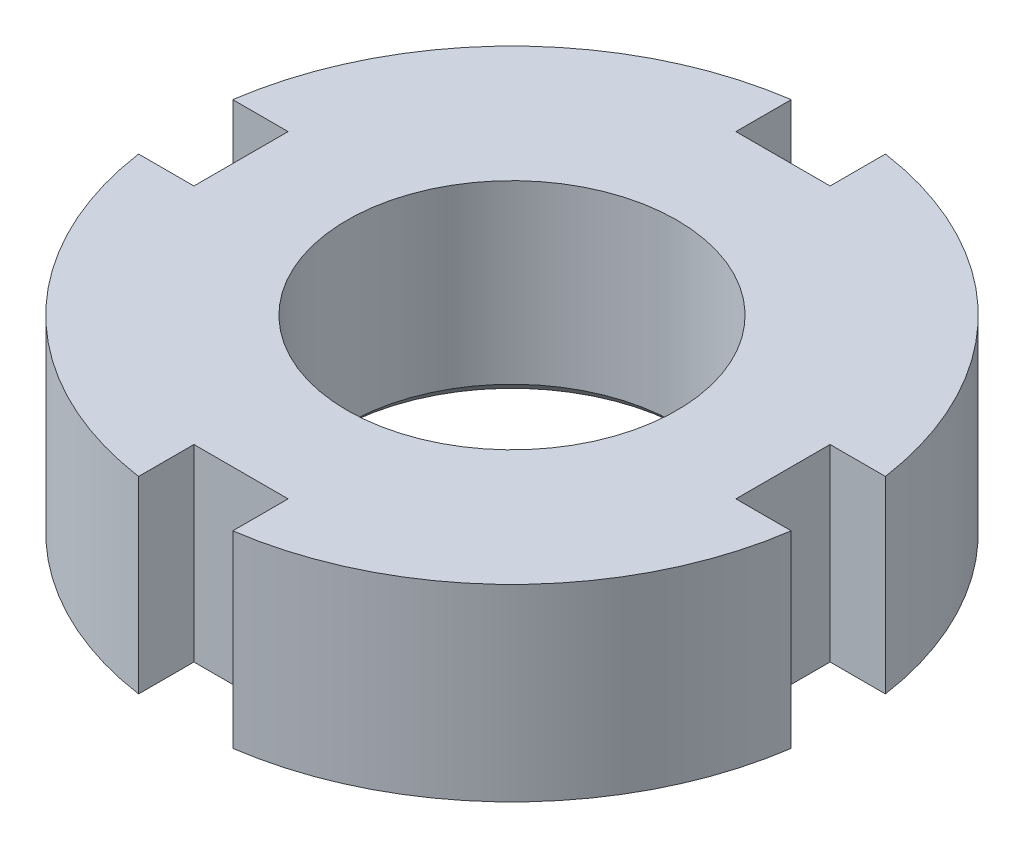
ISO-10303-21;
HEADER;
FILE_DESCRIPTION(('STEP AP214'),'2;1');
FILE_NAME('part.step','',(''),(''),'','','');
FILE_SCHEMA(('AUTOMOTIVE_DESIGN { 1 0 10303 214 1 1 1 1 }'));
ENDSEC;
DATA;
#1=APPLICATION_CONTEXT('core data for automotive mechanical design processes');
#2=APPLICATION_PROTOCOL_DEFINITION('international standard','automotive_design',2000,#1);
#3=PRODUCT_CONTEXT('',#1,'mechanical');
#4=PRODUCT('Part','Part','',(#3));
#5=PRODUCT_RELATED_PRODUCT_CATEGORY('part','',(#4));
#6=PRODUCT_DEFINITION_FORMATION('','',#4);
#7=PRODUCT_DEFINITION_CONTEXT('part definition',#1,'design');
#8=PRODUCT_DEFINITION('design','',#6,#7);
#9=PRODUCT_DEFINITION_SHAPE('','',#8);
#10=(LENGTH_UNIT() NAMED_UNIT(*) SI_UNIT(.MILLI.,.METRE.));
#11=(NAMED_UNIT(*) PLANE_ANGLE_UNIT() SI_UNIT($,.RADIAN.));
#12=(NAMED_UNIT(*) SI_UNIT($,.STERADIAN.) SOLID_ANGLE_UNIT());
#13=UNCERTAINTY_MEASURE_WITH_UNIT(LENGTH_MEASURE(1.E-05),#10,'distance_accuracy_value','');
#14=(GEOMETRIC_REPRESENTATION_CONTEXT(3) GLOBAL_UNCERTAINTY_ASSIGNED_CONTEXT((#13)) GLOBAL_UNIT_ASSIGNED_CONTEXT((#10,
#11,#12)) REPRESENTATION_CONTEXT('',''));
#15=CARTESIAN_POINT('',(0.,0.,0.));
#16=DIRECTION('',(0.,0.,1.));
#17=DIRECTION('',(1.,0.,0.));
#18=AXIS2_PLACEMENT_3D('',#15,#16,#17);
#19=CARTESIAN_POINT('',(23.012812921102,8.,-4.));
#20=DIRECTION('',(-1.,0.,0.));
#21=DIRECTION('',(0.,0.,1.));
#22=AXIS2_PLACEMENT_3D('',#19,#20,#21);
#23=PLANE('',#22);
#24=DIRECTION('',(0.,0.,-1.));
#25=VECTOR('',#24,1.);
#26=CARTESIAN_POINT('',(23.012812921102,-8.,-4.));
#27=LINE('',#26,#25);
#28=CARTESIAN_POINT('',(23.012812921102,-8.,4.));
#29=VERTEX_POINT('',#28);
#30=CARTESIAN_POINT('',(23.012812921102,-8.,-4.));
#31=VERTEX_POINT('',#30);
#32=EDGE_CURVE('E200',#29,#31,#27,.T.);
#33=ORIENTED_EDGE('',*,*,#32,.T.);
#34=DIRECTION('',(0.,-1.,0.));
#35=VECTOR('',#34,1.);
#36=CARTESIAN_POINT('',(23.012812921102,8.,-4.));
#37=LINE('',#36,#35);
#38=CARTESIAN_POINT('',(23.012812921102,8.,-4.));
#39=VERTEX_POINT('',#38);
#40=EDGE_CURVE('E11',#39,#31,#37,.T.);
#41=ORIENTED_EDGE('',*,*,#40,.F.);
#42=DIRECTION('',(0.,0.,-1.));
#43=VECTOR('',#42,1.);
#44=CARTESIAN_POINT('',(23.012812921102,8.,-4.));
#45=LINE('',#44,#43);
#46=CARTESIAN_POINT('',(23.012812921102,8.,4.));
#47=VERTEX_POINT('',#46);
#48=EDGE_CURVE('E247',#47,#39,#45,.T.);
#49=ORIENTED_EDGE('',*,*,#48,.F.);
#50=DIRECTION('',(0.,-1.,0.));
#51=VECTOR('',#50,1.);
#52=CARTESIAN_POINT('',(23.012812921102,8.,4.));
#53=LINE('',#52,#51);
#54=EDGE_CURVE('E196',#47,#29,#53,.T.);
#55=ORIENTED_EDGE('',*,*,#54,.T.);
#56=EDGE_LOOP('',(#33,#41,#49,#55));
#57=FACE_BOUND('',#56,.T.);
#58=ADVANCED_FACE('F51',(#57),#23,.F.);
#59=CARTESIAN_POINT('',(23.012812921102,8.,-4.));
#60=DIRECTION('',(0.,0.,-1.));
#61=DIRECTION('',(-1.,0.,0.));
#62=AXIS2_PLACEMENT_3D('',#59,#60,#61);
#63=PLANE('',#62);
#64=DIRECTION('',(1.,0.,0.));
#65=VECTOR('',#64,1.);
#66=CARTESIAN_POINT('',(23.012812921102,-8.,-4.));
#67=LINE('',#66,#65);
#68=CARTESIAN_POINT('',(27.712812921102,-8.,-4.));
#69=VERTEX_POINT('',#68);
#70=EDGE_CURVE('E204',#31,#69,#67,.T.);
#71=ORIENTED_EDGE('',*,*,#70,.T.);
#72=DIRECTION('',(0.,-1.,0.));
#73=VECTOR('',#72,1.);
#74=CARTESIAN_POINT('',(27.712812921102,8.,-4.));
#75=LINE('',#74,#73);
#76=CARTESIAN_POINT('',(27.712812921102,8.,-4.));
#77=VERTEX_POINT('',#76);
#78=EDGE_CURVE('E60',#77,#69,#75,.T.);
#79=ORIENTED_EDGE('',*,*,#78,.F.);
#80=DIRECTION('',(1.,0.,0.));
#81=VECTOR('',#80,1.);
#82=CARTESIAN_POINT('',(23.012812921102,8.,-4.));
#83=LINE('',#82,#81);
#84=EDGE_CURVE('E135',#39,#77,#83,.T.);
#85=ORIENTED_EDGE('',*,*,#84,.F.);
#86=ORIENTED_EDGE('',*,*,#40,.T.);
#87=EDGE_LOOP('',(#71,#79,#85,#86));
#88=FACE_BOUND('',#87,.T.);
#89=ADVANCED_FACE('F370',(#88),#63,.F.);
#90=CARTESIAN_POINT('',(0.,8.,0.));
#91=DIRECTION('',(0.,-1.,0.));
#92=DIRECTION('',(0.,0.,-1.));
#93=AXIS2_PLACEMENT_3D('',#90,#91,#92);
#94=CYLINDRICAL_SURFACE('',#93,28.);
#95=CARTESIAN_POINT('',(0.,-8.,0.));
#96=DIRECTION('',(0.,1.,0.));
#97=DIRECTION('',(0.,0.,1.));
#98=AXIS2_PLACEMENT_3D('',#95,#96,#97);
#99=CIRCLE('',#98,28.);
#100=CARTESIAN_POINT('',(3.99999999999999,-8.,-27.712812921102));
#101=VERTEX_POINT('',#100);
#102=EDGE_CURVE('E208',#69,#101,#99,.T.);
#103=ORIENTED_EDGE('',*,*,#102,.T.);
#104=DIRECTION('',(0.,-1.,0.));
#105=VECTOR('',#104,1.);
#106=CARTESIAN_POINT('',(3.99999999999999,8.,-27.712812921102));
#107=LINE('',#106,#105);
#108=CARTESIAN_POINT('',(3.99999999999999,8.,-27.712812921102));
#109=VERTEX_POINT('',#108);
#110=EDGE_CURVE('E290',#109,#101,#107,.T.);
#111=ORIENTED_EDGE('',*,*,#110,.F.);
#112=CARTESIAN_POINT('',(0.,8.,0.));
#113=DIRECTION('',(0.,1.,0.));
#114=DIRECTION('',(0.,0.,1.));
#115=AXIS2_PLACEMENT_3D('',#112,#113,#114);
#116=CIRCLE('',#115,28.);
#117=EDGE_CURVE('E300',#77,#109,#116,.T.);
#118=ORIENTED_EDGE('',*,*,#117,.F.);
#119=ORIENTED_EDGE('',*,*,#78,.T.);
#120=EDGE_LOOP('',(#103,#111,#118,#119));
#121=FACE_BOUND('',#120,.T.);
#122=ADVANCED_FACE('F298',(#121),#94,.T.);
#123=CARTESIAN_POINT('',(4.,8.,-23.012812921102));
#124=DIRECTION('',(1.,0.,0.));
#125=DIRECTION('',(0.,0.,-1.));
#126=AXIS2_PLACEMENT_3D('',#123,#124,#125);
#127=PLANE('',#126);
#128=DIRECTION('',(0.,0.,1.));
#129=VECTOR('',#128,1.);
#130=CARTESIAN_POINT('',(4.,-8.,-23.012812921102));
#131=LINE('',#130,#129);
#132=CARTESIAN_POINT('',(4.,-8.,-23.012812921102));
#133=VERTEX_POINT('',#132);
#134=EDGE_CURVE('E211',#101,#133,#131,.T.);
#135=ORIENTED_EDGE('',*,*,#134,.T.);
#136=DIRECTION('',(0.,-1.,0.));
#137=VECTOR('',#136,1.);
#138=CARTESIAN_POINT('',(4.,8.,-23.012812921102));
#139=LINE('',#138,#137);
#140=CARTESIAN_POINT('',(4.,8.,-23.012812921102));
#141=VERTEX_POINT('',#140);
#142=EDGE_CURVE('E286',#141,#133,#139,.T.);
#143=ORIENTED_EDGE('',*,*,#142,.F.);
#144=DIRECTION('',(0.,0.,1.));
#145=VECTOR('',#144,1.);
#146=CARTESIAN_POINT('',(4.,8.,-23.012812921102));
#147=LINE('',#146,#145);
#148=EDGE_CURVE('E319',#109,#141,#147,.T.);
#149=ORIENTED_EDGE('',*,*,#148,.F.);
#150=ORIENTED_EDGE('',*,*,#110,.T.);
#151=EDGE_LOOP('',(#135,#143,#149,#150));
#152=FACE_BOUND('',#151,.T.);
#153=ADVANCED_FACE('F309',(#152),#127,.F.);
#154=CARTESIAN_POINT('',(-4.,8.,-23.012812921102));
#155=DIRECTION('',(0.,0.,1.));
#156=DIRECTION('',(1.,0.,0.));
#157=AXIS2_PLACEMENT_3D('',#154,#155,#156);
#158=PLANE('',#157);
#159=DIRECTION('',(-1.,0.,0.));
#160=VECTOR('',#159,1.);
#161=CARTESIAN_POINT('',(-4.,-8.,-23.012812921102));
#162=LINE('',#161,#160);
#163=CARTESIAN_POINT('',(-4.,-8.,-23.012812921102));
#164=VERTEX_POINT('',#163);
#165=EDGE_CURVE('E214',#133,#164,#162,.T.);
#166=ORIENTED_EDGE('',*,*,#165,.T.);
#167=DIRECTION('',(0.,-1.,0.));
#168=VECTOR('',#167,1.);
#169=CARTESIAN_POINT('',(-4.,8.,-23.012812921102));
#170=LINE('',#169,#168);
#171=CARTESIAN_POINT('',(-4.,8.,-23.012812921102));
#172=VERTEX_POINT('',#171);
#173=EDGE_CURVE('E282',#172,#164,#170,.T.);
#174=ORIENTED_EDGE('',*,*,#173,.F.);
#175=DIRECTION('',(-1.,0.,0.));
#176=VECTOR('',#175,1.);
#177=CARTESIAN_POINT('',(-4.,8.,-23.012812921102));
#178=LINE('',#177,#176);
#179=EDGE_CURVE('E315',#141,#172,#178,.T.);
#180=ORIENTED_EDGE('',*,*,#179,.F.);
#181=ORIENTED_EDGE('',*,*,#142,.T.);
#182=EDGE_LOOP('',(#166,#174,#180,#181));
#183=FACE_BOUND('',#182,.T.);
#184=ADVANCED_FACE('F313',(#183),#158,.F.);
#185=CARTESIAN_POINT('',(-4.,8.,-23.012812921102));
#186=DIRECTION('',(-1.,0.,0.));
#187=DIRECTION('',(0.,0.,1.));
#188=AXIS2_PLACEMENT_3D('',#185,#186,#187);
#189=PLANE('',#188);
#190=DIRECTION('',(0.,0.,-1.));
#191=VECTOR('',#190,1.);
#192=CARTESIAN_POINT('',(-4.,-8.,-23.012812921102));
#193=LINE('',#192,#191);
#194=CARTESIAN_POINT('',(-4.00000000000001,-8.,-27.712812921102));
#195=VERTEX_POINT('',#194);
#196=EDGE_CURVE('E217',#164,#195,#193,.T.);
#197=ORIENTED_EDGE('',*,*,#196,.T.);
#198=DIRECTION('',(0.,-1.,0.));
#199=VECTOR('',#198,1.);
#200=CARTESIAN_POINT('',(-4.00000000000001,8.,-27.712812921102));
#201=LINE('',#200,#199);
#202=CARTESIAN_POINT('',(-4.00000000000001,8.,-27.712812921102));
#203=VERTEX_POINT('',#202);
#204=EDGE_CURVE('E278',#203,#195,#201,.T.);
#205=ORIENTED_EDGE('',*,*,#204,.F.);
#206=DIRECTION('',(0.,0.,-1.));
#207=VECTOR('',#206,1.);
#208=CARTESIAN_POINT('',(-4.,8.,-23.012812921102));
#209=LINE('',#208,#207);
#210=EDGE_CURVE('E318',#172,#203,#209,.T.);
#211=ORIENTED_EDGE('',*,*,#210,.F.);
#212=ORIENTED_EDGE('',*,*,#173,.T.);
#213=EDGE_LOOP('',(#197,#205,#211,#212));
#214=FACE_BOUND('',#213,.T.);
#215=ADVANCED_FACE('F383',(#214),#189,.F.);
#216=CARTESIAN_POINT('',(0.,8.,0.));
#217=DIRECTION('',(0.,-1.,0.));
#218=DIRECTION('',(0.,0.,-1.));
#219=AXIS2_PLACEMENT_3D('',#216,#217,#218);
#220=CYLINDRICAL_SURFACE('',#219,28.);
#221=CARTESIAN_POINT('',(0.,-8.,0.));
#222=DIRECTION('',(0.,1.,0.));
#223=DIRECTION('',(0.,0.,1.));
#224=AXIS2_PLACEMENT_3D('',#221,#222,#223);
#225=CIRCLE('',#224,28.);
#226=CARTESIAN_POINT('',(-27.712812921102,-8.,-4.00000000000002));
#227=VERTEX_POINT('',#226);
#228=EDGE_CURVE('E220',#195,#227,#225,.T.);
#229=ORIENTED_EDGE('',*,*,#228,.T.);
#230=DIRECTION('',(0.,-1.,0.));
#231=VECTOR('',#230,1.);
#232=CARTESIAN_POINT('',(-27.712812921102,8.,-4.00000000000002));
#233=LINE('',#232,#231);
#234=CARTESIAN_POINT('',(-27.712812921102,8.,-4.00000000000002));
#235=VERTEX_POINT('',#234);
#236=EDGE_CURVE('E274',#235,#227,#233,.T.);
#237=ORIENTED_EDGE('',*,*,#236,.F.);
#238=CARTESIAN_POINT('',(0.,8.,0.));
#239=DIRECTION('',(0.,1.,0.));
#240=DIRECTION('',(0.,0.,1.));
#241=AXIS2_PLACEMENT_3D('',#238,#239,#240);
#242=CIRCLE('',#241,28.);
#243=EDGE_CURVE('E323',#203,#235,#242,.T.);
#244=ORIENTED_EDGE('',*,*,#243,.F.);
#245=ORIENTED_EDGE('',*,*,#204,.T.);
#246=EDGE_LOOP('',(#229,#237,#244,#245));
#247=FACE_BOUND('',#246,.T.);
#248=ADVANCED_FACE('F386',(#247),#220,.T.);
#249=CARTESIAN_POINT('',(-23.012812921102,8.,-4.));
#250=DIRECTION('',(0.,0.,-1.));
#251=DIRECTION('',(-1.,0.,0.));
#252=AXIS2_PLACEMENT_3D('',#249,#250,#251);
#253=PLANE('',#252);
#254=DIRECTION('',(1.,0.,0.));
#255=VECTOR('',#254,1.);
#256=CARTESIAN_POINT('',(-23.012812921102,-8.,-4.));
#257=LINE('',#256,#255);
#258=CARTESIAN_POINT('',(-23.012812921102,-8.,-4.));
#259=VERTEX_POINT('',#258);
#260=EDGE_CURVE('E223',#227,#259,#257,.T.);
#261=ORIENTED_EDGE('',*,*,#260,.T.);
#262=DIRECTION('',(0.,-1.,0.));
#263=VECTOR('',#262,1.);
#264=CARTESIAN_POINT('',(-23.012812921102,8.,-4.));
#265=LINE('',#264,#263);
#266=CARTESIAN_POINT('',(-23.012812921102,8.,-4.));
#267=VERTEX_POINT('',#266);
#268=EDGE_CURVE('E270',#267,#259,#265,.T.);
#269=ORIENTED_EDGE('',*,*,#268,.F.);
#270=DIRECTION('',(1.,0.,0.));
#271=VECTOR('',#270,1.);
#272=CARTESIAN_POINT('',(-23.012812921102,8.,-4.));
#273=LINE('',#272,#271);
#274=EDGE_CURVE('E330',#235,#267,#273,.T.);
#275=ORIENTED_EDGE('',*,*,#274,.F.);
#276=ORIENTED_EDGE('',*,*,#236,.T.);
#277=EDGE_LOOP('',(#261,#269,#275,#276));
#278=FACE_BOUND('',#277,.T.);
#279=ADVANCED_FACE('F390',(#278),#253,.F.);
#280=CARTESIAN_POINT('',(-23.012812921102,8.,4.));
#281=DIRECTION('',(1.,0.,0.));
#282=DIRECTION('',(0.,0.,-1.));
#283=AXIS2_PLACEMENT_3D('',#280,#281,#282);
#284=PLANE('',#283);
#285=DIRECTION('',(0.,0.,1.));
#286=VECTOR('',#285,1.);
#287=CARTESIAN_POINT('',(-23.012812921102,-8.,4.));
#288=LINE('',#287,#286);
#289=CARTESIAN_POINT('',(-23.012812921102,-8.,4.));
#290=VERTEX_POINT('',#289);
#291=EDGE_CURVE('E226',#259,#290,#288,.T.);
#292=ORIENTED_EDGE('',*,*,#291,.T.);
#293=DIRECTION('',(0.,-1.,0.));
#294=VECTOR('',#293,1.);
#295=CARTESIAN_POINT('',(-23.012812921102,8.,4.));
#296=LINE('',#295,#294);
#297=CARTESIAN_POINT('',(-23.012812921102,8.,4.));
#298=VERTEX_POINT('',#297);
#299=EDGE_CURVE('E266',#298,#290,#296,.T.);
#300=ORIENTED_EDGE('',*,*,#299,.F.);
#301=DIRECTION('',(0.,0.,1.));
#302=VECTOR('',#301,1.);
#303=CARTESIAN_POINT('',(-23.012812921102,8.,4.));
#304=LINE('',#303,#302);
#305=EDGE_CURVE('E333',#267,#298,#304,.T.);
#306=ORIENTED_EDGE('',*,*,#305,.F.);
#307=ORIENTED_EDGE('',*,*,#268,.T.);
#308=EDGE_LOOP('',(#292,#300,#306,#307));
#309=FACE_BOUND('',#308,.T.);
#310=ADVANCED_FACE('F394',(#309),#284,.F.);
#311=CARTESIAN_POINT('',(-23.012812921102,8.,4.));
#312=DIRECTION('',(0.,0.,1.));
#313=DIRECTION('',(1.,0.,0.));
#314=AXIS2_PLACEMENT_3D('',#311,#312,#313);
#315=PLANE('',#314);
#316=DIRECTION('',(-1.,0.,0.));
#317=VECTOR('',#316,1.);
#318=CARTESIAN_POINT('',(-23.012812921102,-8.,4.));
#319=LINE('',#318,#317);
#320=CARTESIAN_POINT('',(-27.712812921102,-8.,4.));
#321=VERTEX_POINT('',#320);
#322=EDGE_CURVE('E229',#290,#321,#319,.T.);
#323=ORIENTED_EDGE('',*,*,#322,.T.);
#324=DIRECTION('',(0.,-1.,0.));
#325=VECTOR('',#324,1.);
#326=CARTESIAN_POINT('',(-27.712812921102,8.,4.));
#327=LINE('',#326,#325);
#328=CARTESIAN_POINT('',(-27.712812921102,8.,4.));
#329=VERTEX_POINT('',#328);
#330=EDGE_CURVE('E262',#329,#321,#327,.T.);
#331=ORIENTED_EDGE('',*,*,#330,.F.);
#332=DIRECTION('',(-1.,0.,0.));
#333=VECTOR('',#332,1.);
#334=CARTESIAN_POINT('',(-23.012812921102,8.,4.));
#335=LINE('',#334,#333);
#336=EDGE_CURVE('E336',#298,#329,#335,.T.);
#337=ORIENTED_EDGE('',*,*,#336,.F.);
#338=ORIENTED_EDGE('',*,*,#299,.T.);
#339=EDGE_LOOP('',(#323,#331,#337,#338));
#340=FACE_BOUND('',#339,.T.);
#341=ADVANCED_FACE('F398',(#340),#315,.F.);
#342=CARTESIAN_POINT('',(0.,8.,0.));
#343=DIRECTION('',(0.,-1.,0.));
#344=DIRECTION('',(0.,0.,-1.));
#345=AXIS2_PLACEMENT_3D('',#342,#343,#344);
#346=CYLINDRICAL_SURFACE('',#345,28.);
#347=CARTESIAN_POINT('',(0.,-8.,0.));
#348=DIRECTION('',(0.,1.,0.));
#349=DIRECTION('',(0.,0.,1.));
#350=AXIS2_PLACEMENT_3D('',#347,#348,#349);
#351=CIRCLE('',#350,28.);
#352=CARTESIAN_POINT('',(-4.,-8.,27.712812921102));
#353=VERTEX_POINT('',#352);
#354=EDGE_CURVE('E232',#321,#353,#351,.T.);
#355=ORIENTED_EDGE('',*,*,#354,.T.);
#356=DIRECTION('',(0.,-1.,0.));
#357=VECTOR('',#356,1.);
#358=CARTESIAN_POINT('',(-4.,8.,27.712812921102));
#359=LINE('',#358,#357);
#360=CARTESIAN_POINT('',(-4.,8.,27.712812921102));
#361=VERTEX_POINT('',#360);
#362=EDGE_CURVE('E258',#361,#353,#359,.T.);
#363=ORIENTED_EDGE('',*,*,#362,.F.);
#364=CARTESIAN_POINT('',(0.,8.,0.));
#365=DIRECTION('',(0.,1.,0.));
#366=DIRECTION('',(0.,0.,1.));
#367=AXIS2_PLACEMENT_3D('',#364,#365,#366);
#368=CIRCLE('',#367,28.);
#369=EDGE_CURVE('E339',#329,#361,#368,.T.);
#370=ORIENTED_EDGE('',*,*,#369,.F.);
#371=ORIENTED_EDGE('',*,*,#330,.T.);
#372=EDGE_LOOP('',(#355,#363,#370,#371));
#373=FACE_BOUND('',#372,.T.);
#374=ADVANCED_FACE('F402',(#373),#346,.T.);
#375=CARTESIAN_POINT('',(-4.,8.,23.012812921102));
#376=DIRECTION('',(-1.,0.,0.));
#377=DIRECTION('',(0.,0.,1.));
#378=AXIS2_PLACEMENT_3D('',#375,#376,#377);
#379=PLANE('',#378);
#380=DIRECTION('',(0.,0.,-1.));
#381=VECTOR('',#380,1.);
#382=CARTESIAN_POINT('',(-4.,-8.,23.012812921102));
#383=LINE('',#382,#381);
#384=CARTESIAN_POINT('',(-4.,-8.,23.012812921102));
#385=VERTEX_POINT('',#384);
#386=EDGE_CURVE('E235',#353,#385,#383,.T.);
#387=ORIENTED_EDGE('',*,*,#386,.T.);
#388=DIRECTION('',(0.,-1.,0.));
#389=VECTOR('',#388,1.);
#390=CARTESIAN_POINT('',(-4.,8.,23.012812921102));
#391=LINE('',#390,#389);
#392=CARTESIAN_POINT('',(-4.,8.,23.012812921102));
#393=VERTEX_POINT('',#392);
#394=EDGE_CURVE('E254',#393,#385,#391,.T.);
#395=ORIENTED_EDGE('',*,*,#394,.F.);
#396=DIRECTION('',(0.,0.,-1.));
#397=VECTOR('',#396,1.);
#398=CARTESIAN_POINT('',(-4.,8.,23.012812921102));
#399=LINE('',#398,#397);
#400=EDGE_CURVE('E342',#361,#393,#399,.T.);
#401=ORIENTED_EDGE('',*,*,#400,.F.);
#402=ORIENTED_EDGE('',*,*,#362,.T.);
#403=EDGE_LOOP('',(#387,#395,#401,#402));
#404=FACE_BOUND('',#403,.T.);
#405=ADVANCED_FACE('F350',(#404),#379,.F.);
#406=CARTESIAN_POINT('',(4.,8.,23.012812921102));
#407=DIRECTION('',(0.,0.,-1.));
#408=DIRECTION('',(-1.,0.,0.));
#409=AXIS2_PLACEMENT_3D('',#406,#407,#408);
#410=PLANE('',#409);
#411=DIRECTION('',(1.,0.,0.));
#412=VECTOR('',#411,1.);
#413=CARTESIAN_POINT('',(4.,-8.,23.012812921102));
#414=LINE('',#413,#412);
#415=CARTESIAN_POINT('',(4.,-8.,23.012812921102));
#416=VERTEX_POINT('',#415);
#417=EDGE_CURVE('E238',#385,#416,#414,.T.);
#418=ORIENTED_EDGE('',*,*,#417,.T.);
#419=DIRECTION('',(0.,-1.,0.));
#420=VECTOR('',#419,1.);
#421=CARTESIAN_POINT('',(4.,8.,23.012812921102));
#422=LINE('',#421,#420);
#423=CARTESIAN_POINT('',(4.,8.,23.012812921102));
#424=VERTEX_POINT('',#423);
#425=EDGE_CURVE('E189',#424,#416,#422,.T.);
#426=ORIENTED_EDGE('',*,*,#425,.F.);
#427=DIRECTION('',(1.,0.,0.));
#428=VECTOR('',#427,1.);
#429=CARTESIAN_POINT('',(4.,8.,23.012812921102));
#430=LINE('',#429,#428);
#431=EDGE_CURVE('E178',#393,#424,#430,.T.);
#432=ORIENTED_EDGE('',*,*,#431,.F.);
#433=ORIENTED_EDGE('',*,*,#394,.T.);
#434=EDGE_LOOP('',(#418,#426,#432,#433));
#435=FACE_BOUND('',#434,.T.);
#436=ADVANCED_FACE('F354',(#435),#410,.F.);
#437=CARTESIAN_POINT('',(4.,8.,23.012812921102));
#438=DIRECTION('',(1.,0.,0.));
#439=DIRECTION('',(0.,0.,-1.));
#440=AXIS2_PLACEMENT_3D('',#437,#438,#439);
#441=PLANE('',#440);
#442=DIRECTION('',(0.,0.,1.));
#443=VECTOR('',#442,1.);
#444=CARTESIAN_POINT('',(4.,-8.,23.012812921102));
#445=LINE('',#444,#443);
#446=CARTESIAN_POINT('',(4.,-8.,27.712812921102));
#447=VERTEX_POINT('',#446);
#448=EDGE_CURVE('E187',#416,#447,#445,.T.);
#449=ORIENTED_EDGE('',*,*,#448,.T.);
#450=DIRECTION('',(0.,-1.,0.));
#451=VECTOR('',#450,1.);
#452=CARTESIAN_POINT('',(4.,8.,27.712812921102));
#453=LINE('',#452,#451);
#454=CARTESIAN_POINT('',(4.,8.,27.712812921102));
#455=VERTEX_POINT('',#454);
#456=EDGE_CURVE('E184',#455,#447,#453,.T.);
#457=ORIENTED_EDGE('',*,*,#456,.F.);
#458=DIRECTION('',(0.,0.,1.));
#459=VECTOR('',#458,1.);
#460=CARTESIAN_POINT('',(4.,8.,23.012812921102));
#461=LINE('',#460,#459);
#462=EDGE_CURVE('E172',#424,#455,#461,.T.);
#463=ORIENTED_EDGE('',*,*,#462,.F.);
#464=ORIENTED_EDGE('',*,*,#425,.T.);
#465=EDGE_LOOP('',(#449,#457,#463,#464));
#466=FACE_BOUND('',#465,.T.);
#467=ADVANCED_FACE('F185',(#466),#441,.F.);
#468=CARTESIAN_POINT('',(0.,8.,0.));
#469=DIRECTION('',(0.,-1.,0.));
#470=DIRECTION('',(0.,0.,-1.));
#471=AXIS2_PLACEMENT_3D('',#468,#469,#470);
#472=CYLINDRICAL_SURFACE('',#471,28.);
#473=CARTESIAN_POINT('',(0.,-8.,0.));
#474=DIRECTION('',(0.,1.,0.));
#475=DIRECTION('',(0.,0.,1.));
#476=AXIS2_PLACEMENT_3D('',#473,#474,#475);
#477=CIRCLE('',#476,28.);
#478=CARTESIAN_POINT('',(27.712812921102,-8.,4.));
#479=VERTEX_POINT('',#478);
#480=EDGE_CURVE('E121',#447,#479,#477,.T.);
#481=ORIENTED_EDGE('',*,*,#480,.T.);
#482=DIRECTION('',(0.,-1.,0.));
#483=VECTOR('',#482,1.);
#484=CARTESIAN_POINT('',(27.712812921102,8.,4.));
#485=LINE('',#484,#483);
#486=CARTESIAN_POINT('',(27.712812921102,8.,4.));
#487=VERTEX_POINT('',#486);
#488=EDGE_CURVE('E190',#487,#479,#485,.T.);
#489=ORIENTED_EDGE('',*,*,#488,.F.);
#490=CARTESIAN_POINT('',(0.,8.,0.));
#491=DIRECTION('',(0.,1.,0.));
#492=DIRECTION('',(0.,0.,1.));
#493=AXIS2_PLACEMENT_3D('',#490,#491,#492);
#494=CIRCLE('',#493,28.);
#495=EDGE_CURVE('E176',#455,#487,#494,.T.);
#496=ORIENTED_EDGE('',*,*,#495,.F.);
#497=ORIENTED_EDGE('',*,*,#456,.T.);
#498=EDGE_LOOP('',(#481,#489,#496,#497));
#499=FACE_BOUND('',#498,.T.);
#500=ADVANCED_FACE('F192',(#499),#472,.T.);
#501=CARTESIAN_POINT('',(23.012812921102,8.,4.));
#502=DIRECTION('',(0.,0.,1.));
#503=DIRECTION('',(1.,0.,0.));
#504=AXIS2_PLACEMENT_3D('',#501,#502,#503);
#505=PLANE('',#504);
#506=DIRECTION('',(-1.,0.,0.));
#507=VECTOR('',#506,1.);
#508=CARTESIAN_POINT('',(23.012812921102,-8.,4.));
#509=LINE('',#508,#507);
#510=EDGE_CURVE('E127',#479,#29,#509,.T.);
#511=ORIENTED_EDGE('',*,*,#510,.T.);
#512=ORIENTED_EDGE('',*,*,#54,.F.);
#513=DIRECTION('',(-1.,0.,0.));
#514=VECTOR('',#513,1.);
#515=CARTESIAN_POINT('',(23.012812921102,8.,4.));
#516=LINE('',#515,#514);
#517=EDGE_CURVE('E68',#487,#47,#516,.T.);
#518=ORIENTED_EDGE('',*,*,#517,.F.);
#519=ORIENTED_EDGE('',*,*,#488,.T.);
#520=EDGE_LOOP('',(#511,#512,#518,#519));
#521=FACE_BOUND('',#520,.T.);
#522=ADVANCED_FACE('F358',(#521),#505,.F.);
#523=CARTESIAN_POINT('',(0.,8.,0.));
#524=DIRECTION('',(0.,1.,0.));
#525=DIRECTION('',(0.,0.,1.));
#526=AXIS2_PLACEMENT_3D('',#523,#524,#525);
#527=PLANE('',#526);
#528=CARTESIAN_POINT('',(0.,8.,0.));
#529=DIRECTION('',(0.,-1.,0.));
#530=DIRECTION('',(0.,0.,-1.));
#531=AXIS2_PLACEMENT_3D('',#528,#529,#530);
#532=CIRCLE('',#531,14.);
#533=CARTESIAN_POINT('',(0.,8.,-14.));
#534=VERTEX_POINT('',#533);
#535=EDGE_CURVE('E205',#534,#534,#532,.T.);
#536=ORIENTED_EDGE('',*,*,#535,.T.);
#537=EDGE_LOOP('',(#536));
#538=FACE_BOUND('',#537,.T.);
#539=ORIENTED_EDGE('',*,*,#48,.T.);
#540=ORIENTED_EDGE('',*,*,#84,.T.);
#541=ORIENTED_EDGE('',*,*,#117,.T.);
#542=ORIENTED_EDGE('',*,*,#148,.T.);
#543=ORIENTED_EDGE('',*,*,#179,.T.);
#544=ORIENTED_EDGE('',*,*,#210,.T.);
#545=ORIENTED_EDGE('',*,*,#243,.T.);
#546=ORIENTED_EDGE('',*,*,#274,.T.);
#547=ORIENTED_EDGE('',*,*,#305,.T.);
#548=ORIENTED_EDGE('',*,*,#336,.T.);
#549=ORIENTED_EDGE('',*,*,#369,.T.);
#550=ORIENTED_EDGE('',*,*,#400,.T.);
#551=ORIENTED_EDGE('',*,*,#431,.T.);
#552=ORIENTED_EDGE('',*,*,#462,.T.);
#553=ORIENTED_EDGE('',*,*,#495,.T.);
#554=ORIENTED_EDGE('',*,*,#517,.T.);
#555=EDGE_LOOP('',(#539,#540,#541,#542,#543,#544,#545,#546,#547,#548,#549,#550,#551,#552,#553,#554));
#556=FACE_BOUND('',#555,.T.);
#557=ADVANCED_FACE('F174',(#538,#556),#527,.T.);
#558=CARTESIAN_POINT('',(0.,-8.,0.));
#559=DIRECTION('',(0.,1.,0.));
#560=DIRECTION('',(0.,0.,1.));
#561=AXIS2_PLACEMENT_3D('',#558,#559,#560);
#562=PLANE('',#561);
#563=CARTESIAN_POINT('',(0.,-8.,0.));
#564=DIRECTION('',(0.,-1.,0.));
#565=DIRECTION('',(0.,0.,-1.));
#566=AXIS2_PLACEMENT_3D('',#563,#564,#565);
#567=CIRCLE('',#566,15.025);
#568=CARTESIAN_POINT('',(0.,-8.,-15.025));
#569=VERTEX_POINT('',#568);
#570=EDGE_CURVE('E479',#569,#569,#567,.T.);
#571=ORIENTED_EDGE('',*,*,#570,.F.);
#572=EDGE_LOOP('',(#571));
#573=FACE_BOUND('',#572,.T.);
#574=ORIENTED_EDGE('',*,*,#32,.F.);
#575=ORIENTED_EDGE('',*,*,#510,.F.);
#576=ORIENTED_EDGE('',*,*,#480,.F.);
#577=ORIENTED_EDGE('',*,*,#448,.F.);
#578=ORIENTED_EDGE('',*,*,#417,.F.);
#579=ORIENTED_EDGE('',*,*,#386,.F.);
#580=ORIENTED_EDGE('',*,*,#354,.F.);
#581=ORIENTED_EDGE('',*,*,#322,.F.);
#582=ORIENTED_EDGE('',*,*,#291,.F.);
#583=ORIENTED_EDGE('',*,*,#260,.F.);
#584=ORIENTED_EDGE('',*,*,#228,.F.);
#585=ORIENTED_EDGE('',*,*,#196,.F.);
#586=ORIENTED_EDGE('',*,*,#165,.F.);
#587=ORIENTED_EDGE('',*,*,#134,.F.);
#588=ORIENTED_EDGE('',*,*,#102,.F.);
#589=ORIENTED_EDGE('',*,*,#70,.F.);
#590=EDGE_LOOP('',(#574,#575,#576,#577,#578,#579,#580,#581,#582,#583,#584,#585,#586,#587,#588,#589));
#591=FACE_BOUND('',#590,.T.);
#592=ADVANCED_FACE('F304',(#573,#591),#562,.F.);
#593=CARTESIAN_POINT('',(0.,-8.,0.));
#594=DIRECTION('',(0.,-1.,0.));
#595=DIRECTION('',(0.,0.,-1.));
#596=AXIS2_PLACEMENT_3D('',#593,#594,#595);
#597=CYLINDRICAL_SURFACE('',#596,14.);
#598=ORIENTED_EDGE('',*,*,#535,.F.);
#599=EDGE_LOOP('',(#598));
#600=FACE_BOUND('',#599,.T.);
#601=CARTESIAN_POINT('',(0.,-6.97499999999999,0.));
#602=DIRECTION('',(0.,-1.,0.));
#603=DIRECTION('',(0.,0.,-1.));
#604=AXIS2_PLACEMENT_3D('',#601,#602,#603);
#605=CIRCLE('',#604,14.);
#606=CARTESIAN_POINT('',(0.,-6.97499999999999,-14.));
#607=VERTEX_POINT('',#606);
#608=EDGE_CURVE('E476',#607,#607,#605,.T.);
#609=ORIENTED_EDGE('',*,*,#608,.T.);
#610=EDGE_LOOP('',(#609));
#611=FACE_BOUND('',#610,.T.);
#612=ADVANCED_FACE('F442',(#600,#611),#597,.F.);
#613=CARTESIAN_POINT('',(0.,-8.,0.));
#614=DIRECTION('',(0.,-1.,0.));
#615=DIRECTION('',(0.,0.,-1.));
#616=AXIS2_PLACEMENT_3D('',#613,#614,#615);
#617=CONICAL_SURFACE('',#616,15.025,0.785398163397447);
#618=ORIENTED_EDGE('',*,*,#608,.F.);
#619=EDGE_LOOP('',(#618));
#620=FACE_BOUND('',#619,.T.);
#621=ORIENTED_EDGE('',*,*,#570,.T.);
#622=EDGE_LOOP('',(#621));
#623=FACE_BOUND('',#622,.T.);
#624=ADVANCED_FACE('F452',(#620,#623),#617,.F.);
#625=CLOSED_SHELL('',(#58,#89,#122,#153,#184,#215,#248,#279,#310,#341,#374,#405,#436,#467,#500,
#522,#557,#592,#612,#624));
#626=MANIFOLD_SOLID_BREP('B2',#625);
#627=ADVANCED_BREP_SHAPE_REPRESENTATION('',(#18,#626),#14);
#628=SHAPE_DEFINITION_REPRESENTATION(#9,#627);
ENDSEC;
END-ISO-10303-21;
